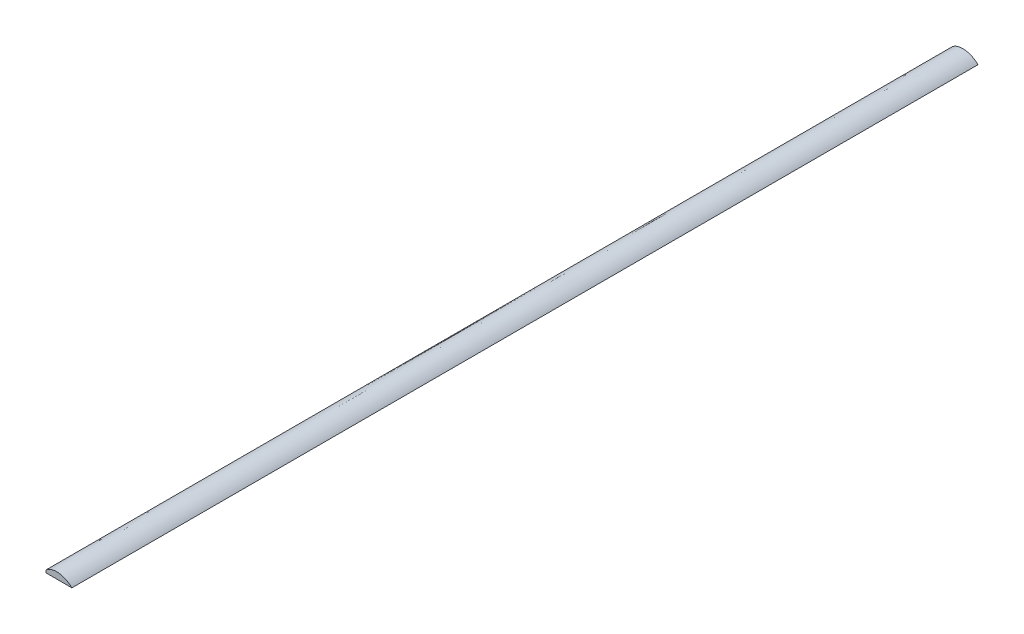
ISO-10303-21;
HEADER;
FILE_DESCRIPTION(('STEP AP214'),'2;1');
FILE_NAME('part.step','',(''),(''),'','','');
FILE_SCHEMA(('AUTOMOTIVE_DESIGN { 1 0 10303 214 1 1 1 1 }'));
ENDSEC;
DATA;
#1=APPLICATION_CONTEXT('core data for automotive mechanical design processes');
#2=APPLICATION_PROTOCOL_DEFINITION('international standard','automotive_design',2000,#1);
#3=PRODUCT_CONTEXT('',#1,'mechanical');
#4=PRODUCT('Part','Part','',(#3));
#5=PRODUCT_RELATED_PRODUCT_CATEGORY('part','',(#4));
#6=PRODUCT_DEFINITION_FORMATION('','',#4);
#7=PRODUCT_DEFINITION_CONTEXT('part definition',#1,'design');
#8=PRODUCT_DEFINITION('design','',#6,#7);
#9=PRODUCT_DEFINITION_SHAPE('','',#8);
#10=(LENGTH_UNIT() NAMED_UNIT(*) SI_UNIT(.MILLI.,.METRE.));
#11=(NAMED_UNIT(*) PLANE_ANGLE_UNIT() SI_UNIT($,.RADIAN.));
#12=(NAMED_UNIT(*) SI_UNIT($,.STERADIAN.) SOLID_ANGLE_UNIT());
#13=UNCERTAINTY_MEASURE_WITH_UNIT(LENGTH_MEASURE(1.E-05),#10,'distance_accuracy_value','');
#14=(GEOMETRIC_REPRESENTATION_CONTEXT(3) GLOBAL_UNCERTAINTY_ASSIGNED_CONTEXT((#13)) GLOBAL_UNIT_ASSIGNED_CONTEXT((#10,
#11,#12)) REPRESENTATION_CONTEXT('',''));
#15=CARTESIAN_POINT('',(0.,0.,0.));
#16=DIRECTION('',(0.,0.,1.));
#17=DIRECTION('',(1.,0.,0.));
#18=AXIS2_PLACEMENT_3D('',#15,#16,#17);
#19=CARTESIAN_POINT('',(0.,0.,-70.));
#20=DIRECTION('',(-1.,0.,0.));
#21=DIRECTION('',(0.,0.,1.));
#22=AXIS2_PLACEMENT_3D('',#19,#20,#21);
#23=PLANE('',#22);
#24=DIRECTION('',(0.,-1.,0.));
#25=VECTOR('',#24,1.);
#26=CARTESIAN_POINT('',(0.,0.,0.));
#27=LINE('',#26,#25);
#28=CARTESIAN_POINT('',(0.,0.2,0.));
#29=VERTEX_POINT('',#28);
#30=CARTESIAN_POINT('',(0.,0.,0.));
#31=VERTEX_POINT('',#30);
#32=EDGE_CURVE('E88',#29,#31,#27,.T.);
#33=ORIENTED_EDGE('',*,*,#32,.F.);
#34=DIRECTION('',(0.,0.,1.));
#35=VECTOR('',#34,1.);
#36=CARTESIAN_POINT('',(0.,0.2,-70.));
#37=LINE('',#36,#35);
#38=CARTESIAN_POINT('',(0.,0.2,-70.));
#39=VERTEX_POINT('',#38);
#40=EDGE_CURVE('E11',#39,#29,#37,.T.);
#41=ORIENTED_EDGE('',*,*,#40,.F.);
#42=DIRECTION('',(0.,-1.,0.));
#43=VECTOR('',#42,1.);
#44=CARTESIAN_POINT('',(0.,0.,-70.));
#45=LINE('',#44,#43);
#46=CARTESIAN_POINT('',(0.,0.,-70.));
#47=VERTEX_POINT('',#46);
#48=EDGE_CURVE('E77',#39,#47,#45,.T.);
#49=ORIENTED_EDGE('',*,*,#48,.T.);
#50=DIRECTION('',(0.,0.,1.));
#51=VECTOR('',#50,1.);
#52=CARTESIAN_POINT('',(0.,0.,-70.));
#53=LINE('',#52,#51);
#54=EDGE_CURVE('E36',#47,#31,#53,.T.);
#55=ORIENTED_EDGE('',*,*,#54,.T.);
#56=EDGE_LOOP('',(#33,#41,#49,#55));
#57=FACE_BOUND('',#56,.T.);
#58=ADVANCED_FACE('F33',(#57),#23,.T.);
#59=CARTESIAN_POINT('',(2.,0.,-70.));
#60=CARTESIAN_POINT('',(1.50922526322279,0.507093259340425,-70.));
#61=CARTESIAN_POINT('',(0.560678206617697,0.701005150171101,-70.));
#62=CARTESIAN_POINT('',(0.,0.2,-70.));
#63=B_SPLINE_CURVE_WITH_KNOTS('',3,(#59,#60,#61,#62),.UNSPECIFIED.,.F.,.F.,(4,4),(0.,1.),.UNSPECIFIED.);
#64=DIRECTION('',(0.,0.,1.));
#65=VECTOR('',#64,1.);
#66=SURFACE_OF_LINEAR_EXTRUSION('',#63,#65);
#67=CARTESIAN_POINT('',(2.,0.,0.));
#68=CARTESIAN_POINT('',(1.50922526322279,0.507093259340425,0.));
#69=CARTESIAN_POINT('',(0.560678206617697,0.701005150171101,0.));
#70=CARTESIAN_POINT('',(0.,0.2,0.));
#71=B_SPLINE_CURVE_WITH_KNOTS('',3,(#67,#68,#69,#70),.UNSPECIFIED.,.F.,.F.,(4,4),(0.,1.),.UNSPECIFIED.);
#72=CARTESIAN_POINT('',(2.,0.,0.));
#73=VERTEX_POINT('',#72);
#74=EDGE_CURVE('E79',#73,#29,#71,.T.);
#75=ORIENTED_EDGE('',*,*,#74,.F.);
#76=DIRECTION('',(0.,0.,1.));
#77=VECTOR('',#76,1.);
#78=CARTESIAN_POINT('',(2.,0.,-70.));
#79=LINE('',#78,#77);
#80=CARTESIAN_POINT('',(2.,0.,-70.));
#81=VERTEX_POINT('',#80);
#82=EDGE_CURVE('E42',#81,#73,#79,.T.);
#83=ORIENTED_EDGE('',*,*,#82,.F.);
#84=EDGE_CURVE('E74',#81,#39,#63,.T.);
#85=ORIENTED_EDGE('',*,*,#84,.T.);
#86=ORIENTED_EDGE('',*,*,#40,.T.);
#87=EDGE_LOOP('',(#75,#83,#85,#86));
#88=FACE_BOUND('',#87,.T.);
#89=ADVANCED_FACE('F94',(#88),#66,.T.);
#90=CARTESIAN_POINT('',(0.,0.,-70.));
#91=DIRECTION('',(0.,-1.,0.));
#92=DIRECTION('',(0.,0.,-1.));
#93=AXIS2_PLACEMENT_3D('',#90,#91,#92);
#94=PLANE('',#93);
#95=DIRECTION('',(1.,0.,0.));
#96=VECTOR('',#95,1.);
#97=CARTESIAN_POINT('',(0.,0.,0.));
#98=LINE('',#97,#96);
#99=EDGE_CURVE('E72',#31,#73,#98,.T.);
#100=ORIENTED_EDGE('',*,*,#99,.F.);
#101=ORIENTED_EDGE('',*,*,#54,.F.);
#102=DIRECTION('',(1.,0.,0.));
#103=VECTOR('',#102,1.);
#104=CARTESIAN_POINT('',(0.,0.,-70.));
#105=LINE('',#104,#103);
#106=EDGE_CURVE('E70',#47,#81,#105,.T.);
#107=ORIENTED_EDGE('',*,*,#106,.T.);
#108=ORIENTED_EDGE('',*,*,#82,.T.);
#109=EDGE_LOOP('',(#100,#101,#107,#108));
#110=FACE_BOUND('',#109,.T.);
#111=ADVANCED_FACE('F69',(#110),#94,.T.);
#112=CARTESIAN_POINT('',(1.02621380119018,0.478036903566822,-70.));
#113=DIRECTION('',(0.,0.,1.));
#114=DIRECTION('',(1.,0.,0.));
#115=AXIS2_PLACEMENT_3D('',#112,#113,#114);
#116=PLANE('',#115);
#117=ORIENTED_EDGE('',*,*,#48,.F.);
#118=ORIENTED_EDGE('',*,*,#84,.F.);
#119=ORIENTED_EDGE('',*,*,#106,.F.);
#120=EDGE_LOOP('',(#117,#118,#119));
#121=FACE_BOUND('',#120,.T.);
#122=ADVANCED_FACE('F76',(#121),#116,.F.);
#123=CARTESIAN_POINT('',(1.02621380119018,0.478036903566822,0.));
#124=DIRECTION('',(0.,0.,1.));
#125=DIRECTION('',(1.,0.,0.));
#126=AXIS2_PLACEMENT_3D('',#123,#124,#125);
#127=PLANE('',#126);
#128=ORIENTED_EDGE('',*,*,#32,.T.);
#129=ORIENTED_EDGE('',*,*,#99,.T.);
#130=ORIENTED_EDGE('',*,*,#74,.T.);
#131=EDGE_LOOP('',(#128,#129,#130));
#132=FACE_BOUND('',#131,.T.);
#133=ADVANCED_FACE('F97',(#132),#127,.T.);
#134=CLOSED_SHELL('',(#58,#89,#111,#122,#133));
#135=MANIFOLD_SOLID_BREP('B2',#134);
#136=ADVANCED_BREP_SHAPE_REPRESENTATION('',(#18,#135),#14);
#137=SHAPE_DEFINITION_REPRESENTATION(#9,#136);
ENDSEC;
END-ISO-10303-21;
